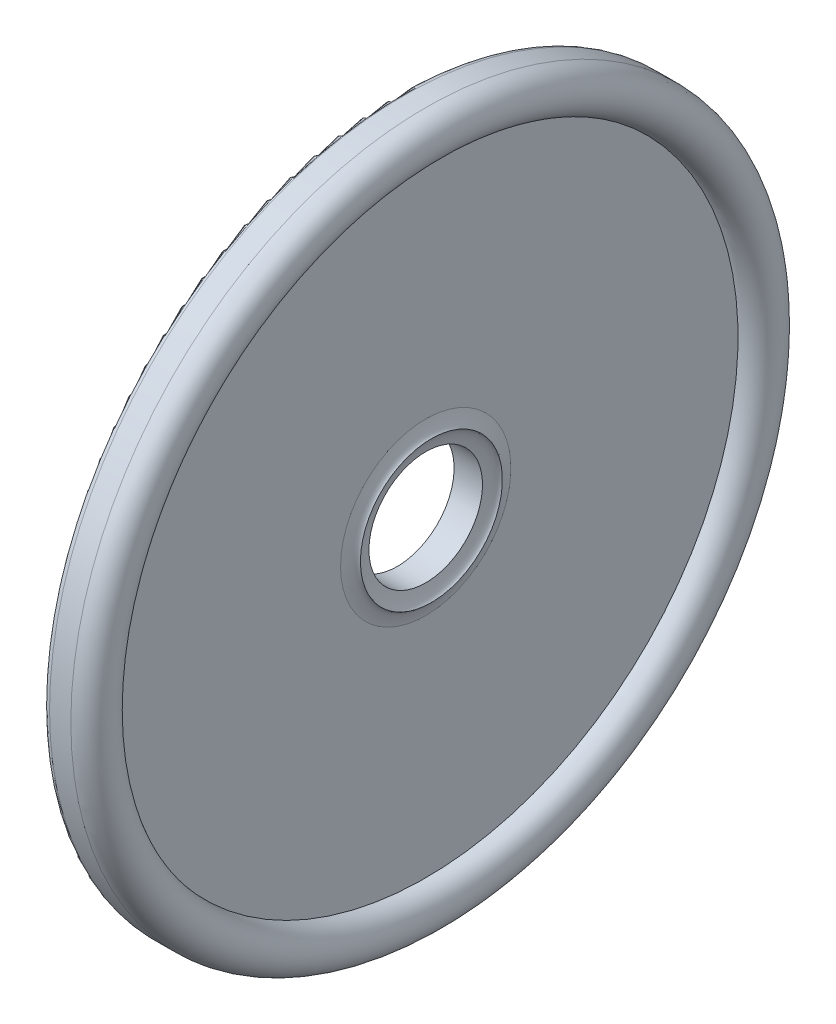
ISO-10303-21;
HEADER;
FILE_DESCRIPTION(('STEP AP214'),'2;1');
FILE_NAME('part.step','',(''),(''),'','','');
FILE_SCHEMA(('AUTOMOTIVE_DESIGN { 1 0 10303 214 1 1 1 1 }'));
ENDSEC;
DATA;
#1=APPLICATION_CONTEXT('core data for automotive mechanical design processes');
#2=APPLICATION_PROTOCOL_DEFINITION('international standard','automotive_design',2000,#1);
#3=PRODUCT_CONTEXT('',#1,'mechanical');
#4=PRODUCT('Part','Part','',(#3));
#5=PRODUCT_RELATED_PRODUCT_CATEGORY('part','',(#4));
#6=PRODUCT_DEFINITION_FORMATION('','',#4);
#7=PRODUCT_DEFINITION_CONTEXT('part definition',#1,'design');
#8=PRODUCT_DEFINITION('design','',#6,#7);
#9=PRODUCT_DEFINITION_SHAPE('','',#8);
#10=(LENGTH_UNIT() NAMED_UNIT(*) SI_UNIT(.MILLI.,.METRE.));
#11=(NAMED_UNIT(*) PLANE_ANGLE_UNIT() SI_UNIT($,.RADIAN.));
#12=(NAMED_UNIT(*) SI_UNIT($,.STERADIAN.) SOLID_ANGLE_UNIT());
#13=UNCERTAINTY_MEASURE_WITH_UNIT(LENGTH_MEASURE(1.E-05),#10,'distance_accuracy_value','');
#14=(GEOMETRIC_REPRESENTATION_CONTEXT(3) GLOBAL_UNCERTAINTY_ASSIGNED_CONTEXT((#13)) GLOBAL_UNIT_ASSIGNED_CONTEXT((#10,
#11,#12)) REPRESENTATION_CONTEXT('',''));
#15=CARTESIAN_POINT('',(0.,0.,0.));
#16=DIRECTION('',(0.,0.,1.));
#17=DIRECTION('',(1.,0.,0.));
#18=AXIS2_PLACEMENT_3D('',#15,#16,#17);
#19=CARTESIAN_POINT('',(1.,3.,0.));
#20=CARTESIAN_POINT('',(1.0782035908286,2.57566875488107,0.));
#21=CARTESIAN_POINT('',(1.2,2.5,0.));
#22=B_SPLINE_CURVE_WITH_KNOTS('',2,(#19,#20,#21),.UNSPECIFIED.,.F.,.F.,(3,3),(0.,
0.432994338417548),.UNSPECIFIED.);
#23=CARTESIAN_POINT('',(-1.44330425123842,0.,0.));
#24=DIRECTION('',(-1.,0.,0.));
#25=AXIS1_PLACEMENT('',#23,#24);
#26=SURFACE_OF_REVOLUTION('',#22,#25);
#27=CARTESIAN_POINT('',(1.2,0.,0.));
#28=DIRECTION('',(-1.,0.,0.));
#29=DIRECTION('',(0.,0.,1.));
#30=AXIS2_PLACEMENT_3D('',#27,#28,#29);
#31=CIRCLE('',#30,2.5);
#32=CARTESIAN_POINT('',(1.2,0.,2.5));
#33=VERTEX_POINT('',#32);
#34=EDGE_CURVE('E10',#33,#33,#31,.T.);
#35=ORIENTED_EDGE('',*,*,#34,.T.);
#36=EDGE_LOOP('',(#35));
#37=FACE_BOUND('',#36,.T.);
#38=CARTESIAN_POINT('',(1.,0.,0.));
#39=DIRECTION('',(-1.,0.,0.));
#40=DIRECTION('',(0.,0.,1.));
#41=AXIS2_PLACEMENT_3D('',#38,#39,#40);
#42=CIRCLE('',#41,3.);
#43=CARTESIAN_POINT('',(1.,0.,3.));
#44=VERTEX_POINT('',#43);
#45=EDGE_CURVE('E69',#44,#44,#42,.T.);
#46=ORIENTED_EDGE('',*,*,#45,.F.);
#47=EDGE_LOOP('',(#46));
#48=FACE_BOUND('',#47,.T.);
#49=ADVANCED_FACE('F40',(#37,#48),#26,.F.);
#50=CARTESIAN_POINT('',(1.2,2.5,0.));
#51=CARTESIAN_POINT('',(1.0782035908286,2.42433124511893,0.));
#52=CARTESIAN_POINT('',(1.,2.,0.));
#53=B_SPLINE_CURVE_WITH_KNOTS('',2,(#50,#51,#52),.UNSPECIFIED.,.F.,.F.,(3,3),(0.,
0.432994338417548),.UNSPECIFIED.);
#54=CARTESIAN_POINT('',(-1.44330425123842,0.,0.));
#55=DIRECTION('',(-1.,0.,0.));
#56=AXIS1_PLACEMENT('',#54,#55);
#57=SURFACE_OF_REVOLUTION('',#53,#56);
#58=CARTESIAN_POINT('',(1.,0.,0.));
#59=DIRECTION('',(-1.,0.,0.));
#60=DIRECTION('',(0.,0.,1.));
#61=AXIS2_PLACEMENT_3D('',#58,#59,#60);
#62=CIRCLE('',#61,2.);
#63=CARTESIAN_POINT('',(1.,0.,2.));
#64=VERTEX_POINT('',#63);
#65=EDGE_CURVE('E47',#64,#64,#62,.T.);
#66=ORIENTED_EDGE('',*,*,#65,.T.);
#67=EDGE_LOOP('',(#66));
#68=FACE_BOUND('',#67,.T.);
#69=ORIENTED_EDGE('',*,*,#34,.F.);
#70=EDGE_LOOP('',(#69));
#71=FACE_BOUND('',#70,.T.);
#72=ADVANCED_FACE('F81',(#68,#71),#57,.F.);
#73=CARTESIAN_POINT('',(-1.44330425123842,0.,0.));
#74=DIRECTION('',(-1.,0.,0.));
#75=DIRECTION('',(0.,0.,1.));
#76=AXIS2_PLACEMENT_3D('',#73,#74,#75);
#77=CYLINDRICAL_SURFACE('',#76,2.);
#78=CARTESIAN_POINT('',(0.,0.,0.));
#79=DIRECTION('',(-1.,0.,0.));
#80=DIRECTION('',(0.,0.,1.));
#81=AXIS2_PLACEMENT_3D('',#78,#79,#80);
#82=CIRCLE('',#81,2.);
#83=CARTESIAN_POINT('',(0.,0.,2.));
#84=VERTEX_POINT('',#83);
#85=EDGE_CURVE('E51',#84,#84,#82,.T.);
#86=ORIENTED_EDGE('',*,*,#85,.T.);
#87=EDGE_LOOP('',(#86));
#88=FACE_BOUND('',#87,.T.);
#89=ORIENTED_EDGE('',*,*,#65,.F.);
#90=EDGE_LOOP('',(#89));
#91=FACE_BOUND('',#90,.T.);
#92=ADVANCED_FACE('F84',(#88,#91),#77,.F.);
#93=CARTESIAN_POINT('',(0.,12.25,0.));
#94=DIRECTION('',(-1.,0.,0.));
#95=DIRECTION('',(0.,0.,1.));
#96=AXIS2_PLACEMENT_3D('',#93,#94,#95);
#97=PLANE('',#96);
#98=CARTESIAN_POINT('',(0.,0.,0.));
#99=DIRECTION('',(-1.,0.,0.));
#100=DIRECTION('',(0.,0.,1.));
#101=AXIS2_PLACEMENT_3D('',#98,#99,#100);
#102=CIRCLE('',#101,12.25);
#103=CARTESIAN_POINT('',(0.,0.,12.25));
#104=VERTEX_POINT('',#103);
#105=EDGE_CURVE('E55',#104,#104,#102,.T.);
#106=ORIENTED_EDGE('',*,*,#105,.T.);
#107=EDGE_LOOP('',(#106));
#108=FACE_BOUND('',#107,.T.);
#109=ORIENTED_EDGE('',*,*,#85,.F.);
#110=EDGE_LOOP('',(#109));
#111=FACE_BOUND('',#110,.T.);
#112=ADVANCED_FACE('F87',(#108,#111),#97,.T.);
#113=CARTESIAN_POINT('',(0.25,0.,0.));
#114=DIRECTION('',(-1.,0.,0.));
#115=DIRECTION('',(0.,0.,1.));
#116=AXIS2_PLACEMENT_3D('',#113,#114,#115);
#117=TOROIDAL_SURFACE('',#116,12.25,0.25);
#118=CARTESIAN_POINT('',(0.250000000000002,0.,0.));
#119=DIRECTION('',(-1.,0.,0.));
#120=DIRECTION('',(0.,0.,1.));
#121=AXIS2_PLACEMENT_3D('',#118,#119,#120);
#122=CIRCLE('',#121,12.5);
#123=CARTESIAN_POINT('',(0.250000000000002,0.,12.5));
#124=VERTEX_POINT('',#123);
#125=EDGE_CURVE('E60',#124,#124,#122,.T.);
#126=ORIENTED_EDGE('',*,*,#125,.T.);
#127=EDGE_LOOP('',(#126));
#128=FACE_BOUND('',#127,.T.);
#129=ORIENTED_EDGE('',*,*,#105,.F.);
#130=EDGE_LOOP('',(#129));
#131=FACE_BOUND('',#130,.T.);
#132=ADVANCED_FACE('F91',(#128,#131),#117,.T.);
#133=CARTESIAN_POINT('',(-1.44330425123842,0.,0.));
#134=DIRECTION('',(-1.,0.,0.));
#135=DIRECTION('',(0.,0.,1.));
#136=AXIS2_PLACEMENT_3D('',#133,#134,#135);
#137=CYLINDRICAL_SURFACE('',#136,12.5);
#138=CARTESIAN_POINT('',(1.,0.,0.));
#139=DIRECTION('',(-1.,0.,0.));
#140=DIRECTION('',(0.,0.,1.));
#141=AXIS2_PLACEMENT_3D('',#138,#139,#140);
#142=CIRCLE('',#141,12.5);
#143=CARTESIAN_POINT('',(1.,0.,12.5));
#144=VERTEX_POINT('',#143);
#145=EDGE_CURVE('E63',#144,#144,#142,.T.);
#146=ORIENTED_EDGE('',*,*,#145,.T.);
#147=EDGE_LOOP('',(#146));
#148=FACE_BOUND('',#147,.T.);
#149=ORIENTED_EDGE('',*,*,#125,.F.);
#150=EDGE_LOOP('',(#149));
#151=FACE_BOUND('',#150,.T.);
#152=ADVANCED_FACE('F95',(#148,#151),#137,.T.);
#153=CARTESIAN_POINT('',(1.,0.,0.));
#154=DIRECTION('',(-1.,0.,0.));
#155=DIRECTION('',(0.,0.,1.));
#156=AXIS2_PLACEMENT_3D('',#153,#154,#155);
#157=TOROIDAL_SURFACE('',#156,11.75,0.749999999999999);
#158=CARTESIAN_POINT('',(1.,0.,0.));
#159=DIRECTION('',(-1.,0.,0.));
#160=DIRECTION('',(0.,0.,1.));
#161=AXIS2_PLACEMENT_3D('',#158,#159,#160);
#162=CIRCLE('',#161,11.);
#163=CARTESIAN_POINT('',(1.,0.,11.));
#164=VERTEX_POINT('',#163);
#165=EDGE_CURVE('E66',#164,#164,#162,.T.);
#166=ORIENTED_EDGE('',*,*,#165,.T.);
#167=EDGE_LOOP('',(#166));
#168=FACE_BOUND('',#167,.T.);
#169=ORIENTED_EDGE('',*,*,#145,.F.);
#170=EDGE_LOOP('',(#169));
#171=FACE_BOUND('',#170,.T.);
#172=ADVANCED_FACE('F99',(#168,#171),#157,.T.);
#173=CARTESIAN_POINT('',(1.,11.,0.));
#174=DIRECTION('',(1.,0.,0.));
#175=DIRECTION('',(0.,0.,-1.));
#176=AXIS2_PLACEMENT_3D('',#173,#174,#175);
#177=PLANE('',#176);
#178=ORIENTED_EDGE('',*,*,#45,.T.);
#179=EDGE_LOOP('',(#178));
#180=FACE_BOUND('',#179,.T.);
#181=ORIENTED_EDGE('',*,*,#165,.F.);
#182=EDGE_LOOP('',(#181));
#183=FACE_BOUND('',#182,.T.);
#184=ADVANCED_FACE('F103',(#180,#183),#177,.T.);
#185=CLOSED_SHELL('',(#49,#72,#92,#112,#132,#152,#172,#184));
#186=MANIFOLD_SOLID_BREP('B2',#185);
#187=ADVANCED_BREP_SHAPE_REPRESENTATION('',(#18,#186),#14);
#188=SHAPE_DEFINITION_REPRESENTATION(#9,#187);
ENDSEC;
END-ISO-10303-21;
